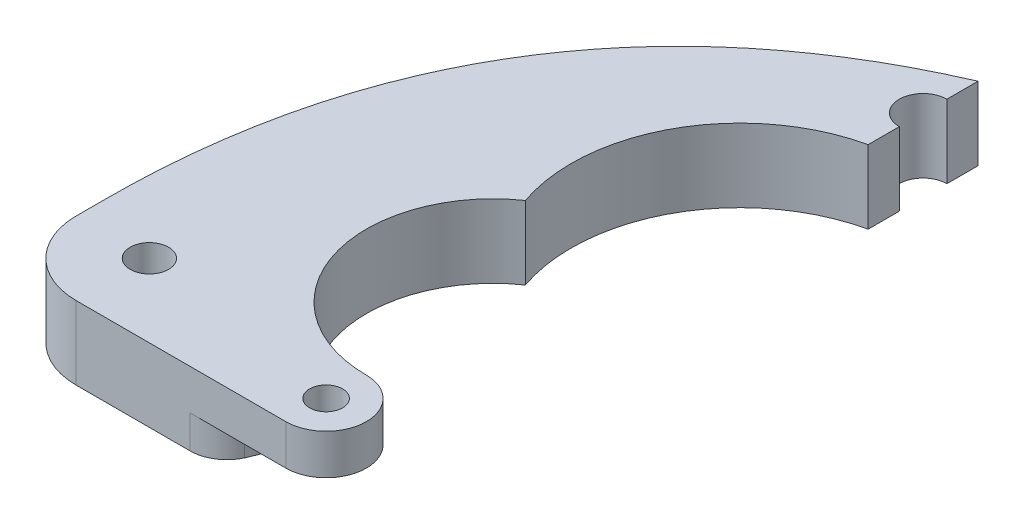
ISO-10303-21;
HEADER;
FILE_DESCRIPTION(('STEP AP214'),'2;1');
FILE_NAME('part.step','',(''),(''),'','','');
FILE_SCHEMA(('AUTOMOTIVE_DESIGN { 1 0 10303 214 1 1 1 1 }'));
ENDSEC;
DATA;
#1=APPLICATION_CONTEXT('core data for automotive mechanical design processes');
#2=APPLICATION_PROTOCOL_DEFINITION('international standard','automotive_design',2000,#1);
#3=PRODUCT_CONTEXT('',#1,'mechanical');
#4=PRODUCT('Part','Part','',(#3));
#5=PRODUCT_RELATED_PRODUCT_CATEGORY('part','',(#4));
#6=PRODUCT_DEFINITION_FORMATION('','',#4);
#7=PRODUCT_DEFINITION_CONTEXT('part definition',#1,'design');
#8=PRODUCT_DEFINITION('design','',#6,#7);
#9=PRODUCT_DEFINITION_SHAPE('','',#8);
#10=(LENGTH_UNIT() NAMED_UNIT(*) SI_UNIT(.MILLI.,.METRE.));
#11=(NAMED_UNIT(*) PLANE_ANGLE_UNIT() SI_UNIT($,.RADIAN.));
#12=(NAMED_UNIT(*) SI_UNIT($,.STERADIAN.) SOLID_ANGLE_UNIT());
#13=UNCERTAINTY_MEASURE_WITH_UNIT(LENGTH_MEASURE(1.E-05),#10,'distance_accuracy_value','');
#14=(GEOMETRIC_REPRESENTATION_CONTEXT(3) GLOBAL_UNCERTAINTY_ASSIGNED_CONTEXT((#13)) GLOBAL_UNIT_ASSIGNED_CONTEXT((#10,
#11,#12)) REPRESENTATION_CONTEXT('',''));
#15=CARTESIAN_POINT('',(0.,0.,0.));
#16=DIRECTION('',(0.,0.,1.));
#17=DIRECTION('',(1.,0.,0.));
#18=AXIS2_PLACEMENT_3D('',#15,#16,#17);
#19=CARTESIAN_POINT('',(0.,4.,-50.));
#20=DIRECTION('',(0.,1.,0.));
#21=DIRECTION('',(0.,0.,1.));
#22=AXIS2_PLACEMENT_3D('',#19,#20,#21);
#23=PLANE('',#22);
#24=CARTESIAN_POINT('',(-2.8,4.,-20.2));
#25=DIRECTION('',(0.,1.,0.));
#26=DIRECTION('',(0.,0.,1.));
#27=AXIS2_PLACEMENT_3D('',#24,#25,#26);
#28=CIRCLE('',#27,0.900000000000002);
#29=CARTESIAN_POINT('',(-2.8,4.,-19.3));
#30=VERTEX_POINT('',#29);
#31=EDGE_CURVE('E246',#30,#30,#28,.T.);
#32=ORIENTED_EDGE('',*,*,#31,.F.);
#33=EDGE_LOOP('',(#32));
#34=FACE_BOUND('',#33,.T.);
#35=CARTESIAN_POINT('',(0.,4.,-50.));
#36=DIRECTION('',(0.,-1.,0.));
#37=DIRECTION('',(0.,0.,1.));
#38=AXIS2_PLACEMENT_3D('',#35,#36,#37);
#39=CIRCLE('',#38,1.3);
#40=CARTESIAN_POINT('',(0.,4.,-48.7));
#41=VERTEX_POINT('',#40);
#42=CARTESIAN_POINT('',(0.,4.,-51.3));
#43=VERTEX_POINT('',#42);
#44=EDGE_CURVE('E220',#41,#43,#39,.T.);
#45=ORIENTED_EDGE('',*,*,#44,.T.);
#46=DIRECTION('',(0.,0.,-1.));
#47=VECTOR('',#46,1.);
#48=CARTESIAN_POINT('',(0.,4.,-51.3));
#49=LINE('',#48,#47);
#50=CARTESIAN_POINT('',(0.,4.,-53.));
#51=VERTEX_POINT('',#50);
#52=EDGE_CURVE('E280',#43,#51,#49,.T.);
#53=ORIENTED_EDGE('',*,*,#52,.T.);
#54=CARTESIAN_POINT('',(0.,4.,-53.));
#55=CARTESIAN_POINT('',(-11.2885860039401,4.,-48.1070694457853));
#56=CARTESIAN_POINT('',(-18.25,4.,-38.6912666099154));
#57=CARTESIAN_POINT('',(-18.25,4.,-23.6));
#58=B_SPLINE_CURVE_WITH_KNOTS('',3,(#54,#55,#56,#57),.UNSPECIFIED.,.F.,.F.,(4,4),(0.,1.),.UNSPECIFIED.);
#59=CARTESIAN_POINT('',(-18.25,4.,-23.6));
#60=VERTEX_POINT('',#59);
#61=EDGE_CURVE('E282',#51,#60,#58,.T.);
#62=ORIENTED_EDGE('',*,*,#61,.T.);
#63=DIRECTION('',(0.,0.,1.));
#64=VECTOR('',#63,1.);
#65=CARTESIAN_POINT('',(-18.25,4.,-23.6));
#66=LINE('',#65,#64);
#67=CARTESIAN_POINT('',(-18.25,4.,-22.));
#68=VERTEX_POINT('',#67);
#69=EDGE_CURVE('E287',#60,#68,#66,.T.);
#70=ORIENTED_EDGE('',*,*,#69,.T.);
#71=CARTESIAN_POINT('',(-14.25,4.,-22.));
#72=DIRECTION('',(0.,1.,0.));
#73=DIRECTION('',(0.,0.,1.));
#74=AXIS2_PLACEMENT_3D('',#71,#72,#73);
#75=CIRCLE('',#74,4.);
#76=CARTESIAN_POINT('',(-14.25,4.,-18.));
#77=VERTEX_POINT('',#76);
#78=EDGE_CURVE('E355',#68,#77,#75,.T.);
#79=ORIENTED_EDGE('',*,*,#78,.T.);
#80=DIRECTION('',(1.,0.,0.));
#81=VECTOR('',#80,1.);
#82=CARTESIAN_POINT('',(-14.25,4.,-18.));
#83=LINE('',#82,#81);
#84=CARTESIAN_POINT('',(-2.8,4.,-18.));
#85=VERTEX_POINT('',#84);
#86=EDGE_CURVE('E237',#77,#85,#83,.T.);
#87=ORIENTED_EDGE('',*,*,#86,.T.);
#88=CARTESIAN_POINT('',(-2.8,4.,-20.2));
#89=DIRECTION('',(0.,1.,0.));
#90=DIRECTION('',(0.,0.,1.));
#91=AXIS2_PLACEMENT_3D('',#88,#89,#90);
#92=CIRCLE('',#91,2.2);
#93=CARTESIAN_POINT('',(-2.8,4.,-22.4));
#94=VERTEX_POINT('',#93);
#95=EDGE_CURVE('E157',#85,#94,#92,.T.);
#96=ORIENTED_EDGE('',*,*,#95,.T.);
#97=CARTESIAN_POINT('',(-2.8,4.,-29.3090928684135));
#98=DIRECTION('',(0.,-1.,0.));
#99=DIRECTION('',(0.,0.,1.));
#100=AXIS2_PLACEMENT_3D('',#97,#98,#99);
#101=CIRCLE('',#100,6.90909286841346);
#102=CARTESIAN_POINT('',(-6.71779788708135,4.,-35.));
#103=VERTEX_POINT('',#102);
#104=EDGE_CURVE('E233',#94,#103,#101,.T.);
#105=ORIENTED_EDGE('',*,*,#104,.T.);
#106=CARTESIAN_POINT('',(2.,4.,-38.));
#107=DIRECTION('',(0.,-1.,0.));
#108=DIRECTION('',(0.,0.,1.));
#109=AXIS2_PLACEMENT_3D('',#106,#107,#108);
#110=CIRCLE('',#109,9.21954445729289);
#111=CARTESIAN_POINT('',(0.,4.,-47.));
#112=VERTEX_POINT('',#111);
#113=EDGE_CURVE('E231',#103,#112,#110,.T.);
#114=ORIENTED_EDGE('',*,*,#113,.T.);
#115=DIRECTION('',(0.,0.,-1.));
#116=VECTOR('',#115,1.);
#117=CARTESIAN_POINT('',(0.,4.,-47.));
#118=LINE('',#117,#116);
#119=EDGE_CURVE('E225',#112,#41,#118,.T.);
#120=ORIENTED_EDGE('',*,*,#119,.T.);
#121=EDGE_LOOP('',(#45,#53,#62,#70,#79,#87,#96,#105,#114,#120));
#122=FACE_BOUND('',#121,.T.);
#123=CARTESIAN_POINT('',(-14.25,4.,-22.));
#124=DIRECTION('',(0.,1.,0.));
#125=DIRECTION('',(0.,0.,1.));
#126=AXIS2_PLACEMENT_3D('',#123,#124,#125);
#127=CIRCLE('',#126,1.05);
#128=CARTESIAN_POINT('',(-14.25,4.,-20.95));
#129=VERTEX_POINT('',#128);
#130=EDGE_CURVE('E271',#129,#129,#127,.T.);
#131=ORIENTED_EDGE('',*,*,#130,.F.);
#132=EDGE_LOOP('',(#131));
#133=FACE_BOUND('',#132,.T.);
#134=ADVANCED_FACE('F34',(#34,#122,#133),#23,.T.);
#135=CARTESIAN_POINT('',(0.,0.,-50.));
#136=DIRECTION('',(0.,1.,0.));
#137=DIRECTION('',(0.,0.,1.));
#138=AXIS2_PLACEMENT_3D('',#135,#136,#137);
#139=PLANE('',#138);
#140=CARTESIAN_POINT('',(-2.8,0.,-29.3090928684135));
#141=DIRECTION('',(0.,-1.,0.));
#142=DIRECTION('',(0.,0.,1.));
#143=AXIS2_PLACEMENT_3D('',#140,#141,#142);
#144=CIRCLE('',#143,6.90909286841346);
#145=CARTESIAN_POINT('',(-6.55493098199108,0.,-23.509432741747));
#146=VERTEX_POINT('',#145);
#147=CARTESIAN_POINT('',(-6.71779788708135,0.,-35.));
#148=VERTEX_POINT('',#147);
#149=EDGE_CURVE('E202',#146,#148,#144,.T.);
#150=ORIENTED_EDGE('',*,*,#149,.F.);
#151=CARTESIAN_POINT('',(-7.64188437905934,0.,-21.8305842338101));
#152=DIRECTION('',(0.,1.,0.));
#153=DIRECTION('',(0.,0.,1.));
#154=AXIS2_PLACEMENT_3D('',#151,#152,#153);
#155=CIRCLE('',#154,2.);
#156=CARTESIAN_POINT('',(-5.64280704937494,0.,-21.8913282042258));
#157=VERTEX_POINT('',#156);
#158=EDGE_CURVE('E188',#146,#157,#155,.F.);
#159=ORIENTED_EDGE('',*,*,#158,.T.);
#160=CARTESIAN_POINT('',(-11.6400390384282,0.,-21.7090962929787));
#161=DIRECTION('',(0.,1.,0.));
#162=DIRECTION('',(0.,0.,1.));
#163=AXIS2_PLACEMENT_3D('',#160,#161,#162);
#164=CIRCLE('',#163,6.);
#165=CARTESIAN_POINT('',(-6.21530612445125,0.,-19.1454518535106));
#166=VERTEX_POINT('',#165);
#167=EDGE_CURVE('E142',#166,#157,#164,.T.);
#168=ORIENTED_EDGE('',*,*,#167,.F.);
#169=CARTESIAN_POINT('',(-8.02355042911022,0.,-20.));
#170=DIRECTION('',(0.,1.,0.));
#171=DIRECTION('',(0.,0.,1.));
#172=AXIS2_PLACEMENT_3D('',#169,#170,#171);
#173=CIRCLE('',#172,2.);
#174=CARTESIAN_POINT('',(-8.02355042911022,0.,-18.));
#175=VERTEX_POINT('',#174);
#176=EDGE_CURVE('E186',#166,#175,#173,.F.);
#177=ORIENTED_EDGE('',*,*,#176,.T.);
#178=DIRECTION('',(1.,0.,0.));
#179=VECTOR('',#178,1.);
#180=CARTESIAN_POINT('',(-14.25,0.,-18.));
#181=LINE('',#180,#179);
#182=CARTESIAN_POINT('',(-14.25,0.,-18.));
#183=VERTEX_POINT('',#182);
#184=EDGE_CURVE('E211',#183,#175,#181,.T.);
#185=ORIENTED_EDGE('',*,*,#184,.F.);
#186=CARTESIAN_POINT('',(-14.25,0.,-22.));
#187=DIRECTION('',(0.,1.,0.));
#188=DIRECTION('',(0.,0.,1.));
#189=AXIS2_PLACEMENT_3D('',#186,#187,#188);
#190=CIRCLE('',#189,4.);
#191=CARTESIAN_POINT('',(-18.25,0.,-22.));
#192=VERTEX_POINT('',#191);
#193=EDGE_CURVE('E215',#192,#183,#190,.T.);
#194=ORIENTED_EDGE('',*,*,#193,.F.);
#195=DIRECTION('',(0.,0.,1.));
#196=VECTOR('',#195,1.);
#197=CARTESIAN_POINT('',(-18.25,0.,-23.6));
#198=LINE('',#197,#196);
#199=CARTESIAN_POINT('',(-18.25,0.,-23.6));
#200=VERTEX_POINT('',#199);
#201=EDGE_CURVE('E252',#200,#192,#198,.T.);
#202=ORIENTED_EDGE('',*,*,#201,.F.);
#203=CARTESIAN_POINT('',(0.,0.,-53.));
#204=CARTESIAN_POINT('',(-11.2885860039401,0.,-48.1070694457853));
#205=CARTESIAN_POINT('',(-18.25,0.,-38.6912666099154));
#206=CARTESIAN_POINT('',(-18.25,0.,-23.6));
#207=B_SPLINE_CURVE_WITH_KNOTS('',3,(#203,#204,#205,#206),.UNSPECIFIED.,.F.,.F.,(4,4),(0.,1.),.UNSPECIFIED.);
#208=CARTESIAN_POINT('',(0.,0.,-53.));
#209=VERTEX_POINT('',#208);
#210=EDGE_CURVE('E248',#209,#200,#207,.T.);
#211=ORIENTED_EDGE('',*,*,#210,.F.);
#212=DIRECTION('',(0.,0.,-1.));
#213=VECTOR('',#212,1.);
#214=CARTESIAN_POINT('',(0.,0.,-51.3));
#215=LINE('',#214,#213);
#216=CARTESIAN_POINT('',(0.,0.,-51.3));
#217=VERTEX_POINT('',#216);
#218=EDGE_CURVE('E245',#217,#209,#215,.T.);
#219=ORIENTED_EDGE('',*,*,#218,.F.);
#220=CARTESIAN_POINT('',(0.,0.,-50.));
#221=DIRECTION('',(0.,-1.,0.));
#222=DIRECTION('',(0.,0.,1.));
#223=AXIS2_PLACEMENT_3D('',#220,#221,#222);
#224=CIRCLE('',#223,1.3);
#225=CARTESIAN_POINT('',(0.,0.,-48.7));
#226=VERTEX_POINT('',#225);
#227=EDGE_CURVE('E242',#226,#217,#224,.T.);
#228=ORIENTED_EDGE('',*,*,#227,.F.);
#229=DIRECTION('',(0.,0.,-1.));
#230=VECTOR('',#229,1.);
#231=CARTESIAN_POINT('',(0.,0.,-47.));
#232=LINE('',#231,#230);
#233=CARTESIAN_POINT('',(0.,0.,-47.));
#234=VERTEX_POINT('',#233);
#235=EDGE_CURVE('E213',#234,#226,#232,.T.);
#236=ORIENTED_EDGE('',*,*,#235,.F.);
#237=CARTESIAN_POINT('',(2.,0.,-38.));
#238=DIRECTION('',(0.,-1.,0.));
#239=DIRECTION('',(0.,0.,1.));
#240=AXIS2_PLACEMENT_3D('',#237,#238,#239);
#241=CIRCLE('',#240,9.21954445729289);
#242=EDGE_CURVE('E210',#148,#234,#241,.T.);
#243=ORIENTED_EDGE('',*,*,#242,.F.);
#244=EDGE_LOOP('',(#150,#159,#168,#177,#185,#194,#202,#211,#219,#228,#236,#243));
#245=FACE_BOUND('',#244,.T.);
#246=CARTESIAN_POINT('',(-14.25,0.,-22.));
#247=DIRECTION('',(0.,1.,0.));
#248=DIRECTION('',(0.,0.,1.));
#249=AXIS2_PLACEMENT_3D('',#246,#247,#248);
#250=CIRCLE('',#249,1.05);
#251=CARTESIAN_POINT('',(-14.25,0.,-20.95));
#252=VERTEX_POINT('',#251);
#253=EDGE_CURVE('E183',#252,#252,#250,.T.);
#254=ORIENTED_EDGE('',*,*,#253,.T.);
#255=EDGE_LOOP('',(#254));
#256=FACE_BOUND('',#255,.T.);
#257=ADVANCED_FACE('F206',(#245,#256),#139,.F.);
#258=CARTESIAN_POINT('',(0.,4.,-50.));
#259=DIRECTION('',(0.,-1.,0.));
#260=DIRECTION('',(0.,0.,-1.));
#261=AXIS2_PLACEMENT_3D('',#258,#259,#260);
#262=CYLINDRICAL_SURFACE('',#261,1.3);
#263=ORIENTED_EDGE('',*,*,#227,.T.);
#264=DIRECTION('',(0.,-1.,0.));
#265=VECTOR('',#264,1.);
#266=CARTESIAN_POINT('',(0.,4.,-51.3));
#267=LINE('',#266,#265);
#268=EDGE_CURVE('E176',#43,#217,#267,.T.);
#269=ORIENTED_EDGE('',*,*,#268,.F.);
#270=ORIENTED_EDGE('',*,*,#44,.F.);
#271=DIRECTION('',(0.,-1.,0.));
#272=VECTOR('',#271,1.);
#273=CARTESIAN_POINT('',(0.,4.,-48.7));
#274=LINE('',#273,#272);
#275=EDGE_CURVE('E221',#41,#226,#274,.T.);
#276=ORIENTED_EDGE('',*,*,#275,.T.);
#277=EDGE_LOOP('',(#263,#269,#270,#276));
#278=FACE_BOUND('',#277,.T.);
#279=ADVANCED_FACE('F303',(#278),#262,.F.);
#280=CARTESIAN_POINT('',(0.,4.,-51.3));
#281=DIRECTION('',(-1.,0.,0.));
#282=DIRECTION('',(0.,0.,1.));
#283=AXIS2_PLACEMENT_3D('',#280,#281,#282);
#284=PLANE('',#283);
#285=ORIENTED_EDGE('',*,*,#218,.T.);
#286=DIRECTION('',(0.,-1.,0.));
#287=VECTOR('',#286,1.);
#288=CARTESIAN_POINT('',(0.,4.,-53.));
#289=LINE('',#288,#287);
#290=EDGE_CURVE('E173',#51,#209,#289,.T.);
#291=ORIENTED_EDGE('',*,*,#290,.F.);
#292=ORIENTED_EDGE('',*,*,#52,.F.);
#293=ORIENTED_EDGE('',*,*,#268,.T.);
#294=EDGE_LOOP('',(#285,#291,#292,#293));
#295=FACE_BOUND('',#294,.T.);
#296=ADVANCED_FACE('F298',(#295),#284,.F.);
#297=DIRECTION('',(0.,-1.,0.));
#298=VECTOR('',#297,1.);
#299=SURFACE_OF_LINEAR_EXTRUSION('',#58,#298);
#300=ORIENTED_EDGE('',*,*,#210,.T.);
#301=DIRECTION('',(0.,-1.,0.));
#302=VECTOR('',#301,1.);
#303=CARTESIAN_POINT('',(-18.25,4.,-23.6));
#304=LINE('',#303,#302);
#305=EDGE_CURVE('E170',#60,#200,#304,.T.);
#306=ORIENTED_EDGE('',*,*,#305,.F.);
#307=ORIENTED_EDGE('',*,*,#61,.F.);
#308=ORIENTED_EDGE('',*,*,#290,.T.);
#309=EDGE_LOOP('',(#300,#306,#307,#308));
#310=FACE_BOUND('',#309,.T.);
#311=ADVANCED_FACE('F293',(#310),#299,.F.);
#312=CARTESIAN_POINT('',(-18.25,4.,-23.6));
#313=DIRECTION('',(1.,0.,0.));
#314=DIRECTION('',(0.,0.,-1.));
#315=AXIS2_PLACEMENT_3D('',#312,#313,#314);
#316=PLANE('',#315);
#317=ORIENTED_EDGE('',*,*,#201,.T.);
#318=DIRECTION('',(0.,-1.,0.));
#319=VECTOR('',#318,1.);
#320=CARTESIAN_POINT('',(-18.25,4.,-22.));
#321=LINE('',#320,#319);
#322=EDGE_CURVE('E162',#68,#192,#321,.T.);
#323=ORIENTED_EDGE('',*,*,#322,.F.);
#324=ORIENTED_EDGE('',*,*,#69,.F.);
#325=ORIENTED_EDGE('',*,*,#305,.T.);
#326=EDGE_LOOP('',(#317,#323,#324,#325));
#327=FACE_BOUND('',#326,.T.);
#328=ADVANCED_FACE('F297',(#327),#316,.F.);
#329=CARTESIAN_POINT('',(-14.25,4.,-22.));
#330=DIRECTION('',(0.,-1.,0.));
#331=DIRECTION('',(0.,0.,-1.));
#332=AXIS2_PLACEMENT_3D('',#329,#330,#331);
#333=CYLINDRICAL_SURFACE('',#332,4.);
#334=ORIENTED_EDGE('',*,*,#193,.T.);
#335=DIRECTION('',(0.,-1.,0.));
#336=VECTOR('',#335,1.);
#337=CARTESIAN_POINT('',(-14.25,4.,-18.));
#338=LINE('',#337,#336);
#339=EDGE_CURVE('E158',#77,#183,#338,.T.);
#340=ORIENTED_EDGE('',*,*,#339,.F.);
#341=ORIENTED_EDGE('',*,*,#78,.F.);
#342=ORIENTED_EDGE('',*,*,#322,.T.);
#343=EDGE_LOOP('',(#334,#340,#341,#342));
#344=FACE_BOUND('',#343,.T.);
#345=ADVANCED_FACE('F259',(#344),#333,.T.);
#346=CARTESIAN_POINT('',(-14.25,4.,-18.));
#347=DIRECTION('',(0.,0.,-1.));
#348=DIRECTION('',(-1.,0.,0.));
#349=AXIS2_PLACEMENT_3D('',#346,#347,#348);
#350=PLANE('',#349);
#351=ORIENTED_EDGE('',*,*,#184,.T.);
#352=DIRECTION('',(0.,-1.,0.));
#353=VECTOR('',#352,1.);
#354=CARTESIAN_POINT('',(-8.02355042911022,4.,-18.));
#355=LINE('',#354,#353);
#356=CARTESIAN_POINT('',(-8.02355042911022,1.8,-18.));
#357=VERTEX_POINT('',#356);
#358=EDGE_CURVE('E152',#175,#357,#355,.F.);
#359=ORIENTED_EDGE('',*,*,#358,.T.);
#360=DIRECTION('',(-1.,0.,0.));
#361=VECTOR('',#360,1.);
#362=CARTESIAN_POINT('',(-6.92383243890227,1.8,-18.));
#363=LINE('',#362,#361);
#364=CARTESIAN_POINT('',(-2.8,1.8,-18.));
#365=VERTEX_POINT('',#364);
#366=EDGE_CURVE('E48',#365,#357,#363,.T.);
#367=ORIENTED_EDGE('',*,*,#366,.F.);
#368=DIRECTION('',(0.,-1.,0.));
#369=VECTOR('',#368,1.);
#370=CARTESIAN_POINT('',(-2.8,4.,-18.));
#371=LINE('',#370,#369);
#372=EDGE_CURVE('E149',#85,#365,#371,.T.);
#373=ORIENTED_EDGE('',*,*,#372,.F.);
#374=ORIENTED_EDGE('',*,*,#86,.F.);
#375=ORIENTED_EDGE('',*,*,#339,.T.);
#376=EDGE_LOOP('',(#351,#359,#367,#373,#374,#375));
#377=FACE_BOUND('',#376,.T.);
#378=ADVANCED_FACE('F147',(#377),#350,.F.);
#379=CARTESIAN_POINT('',(-2.8,4.,-20.2));
#380=DIRECTION('',(0.,-1.,0.));
#381=DIRECTION('',(0.,0.,-1.));
#382=AXIS2_PLACEMENT_3D('',#379,#380,#381);
#383=CYLINDRICAL_SURFACE('',#382,2.2);
#384=ORIENTED_EDGE('',*,*,#372,.T.);
#385=CARTESIAN_POINT('',(-2.8,1.8,-20.2));
#386=DIRECTION('',(0.,-1.,0.));
#387=DIRECTION('',(0.,0.,1.));
#388=AXIS2_PLACEMENT_3D('',#385,#386,#387);
#389=CIRCLE('',#388,2.2);
#390=CARTESIAN_POINT('',(-2.8,1.8,-22.4));
#391=VERTEX_POINT('',#390);
#392=EDGE_CURVE('E134',#391,#365,#389,.T.);
#393=ORIENTED_EDGE('',*,*,#392,.F.);
#394=DIRECTION('',(0.,-1.,0.));
#395=VECTOR('',#394,1.);
#396=CARTESIAN_POINT('',(-2.8,4.,-22.4));
#397=LINE('',#396,#395);
#398=EDGE_CURVE('E159',#94,#391,#397,.T.);
#399=ORIENTED_EDGE('',*,*,#398,.F.);
#400=ORIENTED_EDGE('',*,*,#95,.F.);
#401=EDGE_LOOP('',(#384,#393,#399,#400));
#402=FACE_BOUND('',#401,.T.);
#403=ADVANCED_FACE('F156',(#402),#383,.T.);
#404=CARTESIAN_POINT('',(-2.8,4.,-29.3090928684135));
#405=DIRECTION('',(0.,-1.,0.));
#406=DIRECTION('',(0.,0.,-1.));
#407=AXIS2_PLACEMENT_3D('',#404,#405,#406);
#408=CYLINDRICAL_SURFACE('',#407,6.90909286841346);
#409=CARTESIAN_POINT('',(-2.80000000000013,1.8,-29.3090928684129));
#410=DIRECTION('',(0.,1.,0.));
#411=DIRECTION('',(0.,0.,-1.));
#412=AXIS2_PLACEMENT_3D('',#409,#410,#411);
#413=CIRCLE('',#412,6.90909286841286);
#414=CARTESIAN_POINT('',(-6.55493098199106,1.8,-23.509432741747));
#415=VERTEX_POINT('',#414);
#416=EDGE_CURVE('E137',#415,#391,#413,.T.);
#417=ORIENTED_EDGE('',*,*,#416,.F.);
#418=DIRECTION('',(0.,-1.,0.));
#419=VECTOR('',#418,1.);
#420=CARTESIAN_POINT('',(-6.55493098199108,4.,-23.509432741747));
#421=LINE('',#420,#419);
#422=EDGE_CURVE('E179',#415,#146,#421,.T.);
#423=ORIENTED_EDGE('',*,*,#422,.T.);
#424=ORIENTED_EDGE('',*,*,#149,.T.);
#425=DIRECTION('',(0.,-1.,0.));
#426=VECTOR('',#425,1.);
#427=CARTESIAN_POINT('',(-6.71779788708135,4.,-35.));
#428=LINE('',#427,#426);
#429=EDGE_CURVE('E164',#103,#148,#428,.T.);
#430=ORIENTED_EDGE('',*,*,#429,.F.);
#431=ORIENTED_EDGE('',*,*,#104,.F.);
#432=ORIENTED_EDGE('',*,*,#398,.T.);
#433=EDGE_LOOP('',(#417,#423,#424,#430,#431,#432));
#434=FACE_BOUND('',#433,.T.);
#435=ADVANCED_FACE('F200',(#434),#408,.F.);
#436=CARTESIAN_POINT('',(2.,4.,-38.));
#437=DIRECTION('',(0.,-1.,0.));
#438=DIRECTION('',(0.,0.,-1.));
#439=AXIS2_PLACEMENT_3D('',#436,#437,#438);
#440=CYLINDRICAL_SURFACE('',#439,9.21954445729289);
#441=ORIENTED_EDGE('',*,*,#242,.T.);
#442=DIRECTION('',(0.,-1.,0.));
#443=VECTOR('',#442,1.);
#444=CARTESIAN_POINT('',(0.,4.,-47.));
#445=LINE('',#444,#443);
#446=EDGE_CURVE('E224',#112,#234,#445,.T.);
#447=ORIENTED_EDGE('',*,*,#446,.F.);
#448=ORIENTED_EDGE('',*,*,#113,.F.);
#449=ORIENTED_EDGE('',*,*,#429,.T.);
#450=EDGE_LOOP('',(#441,#447,#448,#449));
#451=FACE_BOUND('',#450,.T.);
#452=ADVANCED_FACE('F229',(#451),#440,.F.);
#453=CARTESIAN_POINT('',(0.,4.,-47.));
#454=DIRECTION('',(-1.,0.,0.));
#455=DIRECTION('',(0.,0.,1.));
#456=AXIS2_PLACEMENT_3D('',#453,#454,#455);
#457=PLANE('',#456);
#458=ORIENTED_EDGE('',*,*,#235,.T.);
#459=ORIENTED_EDGE('',*,*,#275,.F.);
#460=ORIENTED_EDGE('',*,*,#119,.F.);
#461=ORIENTED_EDGE('',*,*,#446,.T.);
#462=EDGE_LOOP('',(#458,#459,#460,#461));
#463=FACE_BOUND('',#462,.T.);
#464=ADVANCED_FACE('F326',(#463),#457,.F.);
#465=CARTESIAN_POINT('',(-2.8,4.,-20.2));
#466=DIRECTION('',(0.,-1.,0.));
#467=DIRECTION('',(0.,0.,-1.));
#468=AXIS2_PLACEMENT_3D('',#465,#466,#467);
#469=CYLINDRICAL_SURFACE('',#468,0.900000000000002);
#470=CARTESIAN_POINT('',(-2.8,1.8,-20.2));
#471=DIRECTION('',(0.,1.,0.));
#472=DIRECTION('',(0.,0.,1.));
#473=AXIS2_PLACEMENT_3D('',#470,#471,#472);
#474=CIRCLE('',#473,0.900000000000002);
#475=CARTESIAN_POINT('',(-2.8,1.8,-19.3));
#476=VERTEX_POINT('',#475);
#477=EDGE_CURVE('E180',#476,#476,#474,.T.);
#478=ORIENTED_EDGE('',*,*,#477,.F.);
#479=EDGE_LOOP('',(#478));
#480=FACE_BOUND('',#479,.T.);
#481=ORIENTED_EDGE('',*,*,#31,.T.);
#482=EDGE_LOOP('',(#481));
#483=FACE_BOUND('',#482,.T.);
#484=ADVANCED_FACE('F323',(#480,#483),#469,.F.);
#485=CARTESIAN_POINT('',(-14.25,4.,-22.));
#486=DIRECTION('',(0.,-1.,0.));
#487=DIRECTION('',(0.,0.,-1.));
#488=AXIS2_PLACEMENT_3D('',#485,#486,#487);
#489=CYLINDRICAL_SURFACE('',#488,1.05);
#490=ORIENTED_EDGE('',*,*,#130,.T.);
#491=EDGE_LOOP('',(#490));
#492=FACE_BOUND('',#491,.T.);
#493=ORIENTED_EDGE('',*,*,#253,.F.);
#494=EDGE_LOOP('',(#493));
#495=FACE_BOUND('',#494,.T.);
#496=ADVANCED_FACE('F358',(#492,#495),#489,.F.);
#497=CARTESIAN_POINT('',(-11.6400390384282,1.8,-21.7090962929787));
#498=DIRECTION('',(0.,-1.,0.));
#499=DIRECTION('',(0.,0.,-1.));
#500=AXIS2_PLACEMENT_3D('',#497,#498,#499);
#501=CYLINDRICAL_SURFACE('',#500,6.);
#502=ORIENTED_EDGE('',*,*,#167,.T.);
#503=DIRECTION('',(0.,-1.,0.));
#504=VECTOR('',#503,1.);
#505=CARTESIAN_POINT('',(-5.64280704937494,1.8,-21.8913282042258));
#506=LINE('',#505,#504);
#507=CARTESIAN_POINT('',(-5.64280704937494,1.8,-21.8913282042258));
#508=VERTEX_POINT('',#507);
#509=EDGE_CURVE('E56',#157,#508,#506,.F.);
#510=ORIENTED_EDGE('',*,*,#509,.T.);
#511=CARTESIAN_POINT('',(-11.6400390384282,1.8,-21.7090962929787));
#512=DIRECTION('',(0.,1.,0.));
#513=DIRECTION('',(0.,0.,1.));
#514=AXIS2_PLACEMENT_3D('',#511,#512,#513);
#515=CIRCLE('',#514,6.);
#516=CARTESIAN_POINT('',(-6.21530612445125,1.8,-19.1454518535106));
#517=VERTEX_POINT('',#516);
#518=EDGE_CURVE('E154',#517,#508,#515,.T.);
#519=ORIENTED_EDGE('',*,*,#518,.F.);
#520=DIRECTION('',(0.,-1.,0.));
#521=VECTOR('',#520,1.);
#522=CARTESIAN_POINT('',(-6.21530612445125,1.8,-19.1454518535106));
#523=LINE('',#522,#521);
#524=EDGE_CURVE('E190',#517,#166,#523,.T.);
#525=ORIENTED_EDGE('',*,*,#524,.T.);
#526=EDGE_LOOP('',(#502,#510,#519,#525));
#527=FACE_BOUND('',#526,.T.);
#528=ADVANCED_FACE('F266',(#527),#501,.T.);
#529=CARTESIAN_POINT('',(-2.8,1.8,-20.2));
#530=DIRECTION('',(0.,1.,0.));
#531=DIRECTION('',(0.,0.,1.));
#532=AXIS2_PLACEMENT_3D('',#529,#530,#531);
#533=PLANE('',#532);
#534=ORIENTED_EDGE('',*,*,#477,.T.);
#535=EDGE_LOOP('',(#534));
#536=FACE_BOUND('',#535,.T.);
#537=ORIENTED_EDGE('',*,*,#392,.T.);
#538=ORIENTED_EDGE('',*,*,#366,.T.);
#539=CARTESIAN_POINT('',(-8.02355042911022,1.8,-20.));
#540=DIRECTION('',(0.,1.,0.));
#541=DIRECTION('',(0.,0.,1.));
#542=AXIS2_PLACEMENT_3D('',#539,#540,#541);
#543=CIRCLE('',#542,2.);
#544=EDGE_CURVE('E11',#357,#517,#543,.T.);
#545=ORIENTED_EDGE('',*,*,#544,.T.);
#546=ORIENTED_EDGE('',*,*,#518,.T.);
#547=CARTESIAN_POINT('',(-7.64188437905934,1.8,-21.8305842338101));
#548=DIRECTION('',(0.,1.,0.));
#549=DIRECTION('',(0.,0.,1.));
#550=AXIS2_PLACEMENT_3D('',#547,#548,#549);
#551=CIRCLE('',#550,2.);
#552=EDGE_CURVE('E42',#508,#415,#551,.T.);
#553=ORIENTED_EDGE('',*,*,#552,.T.);
#554=ORIENTED_EDGE('',*,*,#416,.T.);
#555=EDGE_LOOP('',(#537,#538,#545,#546,#553,#554));
#556=FACE_BOUND('',#555,.T.);
#557=ADVANCED_FACE('F135',(#536,#556),#533,.F.);
#558=CARTESIAN_POINT('',(-7.64188437905934,1.8,-21.8305842338101));
#559=DIRECTION('',(0.,1.,0.));
#560=DIRECTION('',(0.,0.,1.));
#561=AXIS2_PLACEMENT_3D('',#558,#559,#560);
#562=CYLINDRICAL_SURFACE('',#561,2.);
#563=ORIENTED_EDGE('',*,*,#552,.F.);
#564=ORIENTED_EDGE('',*,*,#509,.F.);
#565=ORIENTED_EDGE('',*,*,#158,.F.);
#566=ORIENTED_EDGE('',*,*,#422,.F.);
#567=EDGE_LOOP('',(#563,#564,#565,#566));
#568=FACE_BOUND('',#567,.T.);
#569=ADVANCED_FACE('F197',(#568),#562,.T.);
#570=CARTESIAN_POINT('',(-8.02355042911022,1.8,-20.));
#571=DIRECTION('',(0.,-1.,0.));
#572=DIRECTION('',(0.,0.,-1.));
#573=AXIS2_PLACEMENT_3D('',#570,#571,#572);
#574=CYLINDRICAL_SURFACE('',#573,2.);
#575=ORIENTED_EDGE('',*,*,#544,.F.);
#576=ORIENTED_EDGE('',*,*,#358,.F.);
#577=ORIENTED_EDGE('',*,*,#176,.F.);
#578=ORIENTED_EDGE('',*,*,#524,.F.);
#579=EDGE_LOOP('',(#575,#576,#577,#578));
#580=FACE_BOUND('',#579,.T.);
#581=ADVANCED_FACE('F36',(#580),#574,.T.);
#582=CLOSED_SHELL('',(#134,#257,#279,#296,#311,#328,#345,#378,#403,#435,#452,#464,#484,#496,
#528,#557,#569,#581));
#583=MANIFOLD_SOLID_BREP('B2',#582);
#584=ADVANCED_BREP_SHAPE_REPRESENTATION('',(#18,#583),#14);
#585=SHAPE_DEFINITION_REPRESENTATION(#9,#584);
ENDSEC;
END-ISO-10303-21;
